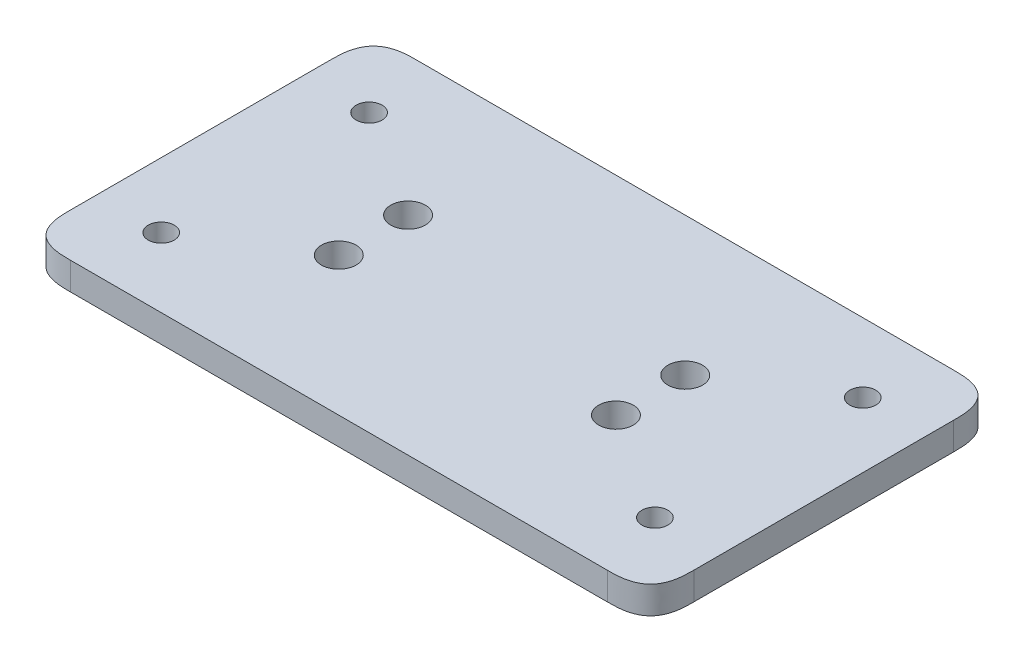
ISO-10303-21;
HEADER;
FILE_DESCRIPTION(('STEP AP214'),'2;1');
FILE_NAME('part.step','',(''),(''),'','','');
FILE_SCHEMA(('AUTOMOTIVE_DESIGN { 1 0 10303 214 1 1 1 1 }'));
ENDSEC;
DATA;
#1=APPLICATION_CONTEXT('core data for automotive mechanical design processes');
#2=APPLICATION_PROTOCOL_DEFINITION('international standard','automotive_design',2000,#1);
#3=PRODUCT_CONTEXT('',#1,'mechanical');
#4=PRODUCT('Part','Part','',(#3));
#5=PRODUCT_RELATED_PRODUCT_CATEGORY('part','',(#4));
#6=PRODUCT_DEFINITION_FORMATION('','',#4);
#7=PRODUCT_DEFINITION_CONTEXT('part definition',#1,'design');
#8=PRODUCT_DEFINITION('design','',#6,#7);
#9=PRODUCT_DEFINITION_SHAPE('','',#8);
#10=(LENGTH_UNIT() NAMED_UNIT(*) SI_UNIT(.MILLI.,.METRE.));
#11=(NAMED_UNIT(*) PLANE_ANGLE_UNIT() SI_UNIT($,.RADIAN.));
#12=(NAMED_UNIT(*) SI_UNIT($,.STERADIAN.) SOLID_ANGLE_UNIT());
#13=UNCERTAINTY_MEASURE_WITH_UNIT(LENGTH_MEASURE(1.E-05),#10,'distance_accuracy_value','');
#14=(GEOMETRIC_REPRESENTATION_CONTEXT(3) GLOBAL_UNCERTAINTY_ASSIGNED_CONTEXT((#13)) GLOBAL_UNIT_ASSIGNED_CONTEXT((#10,
#11,#12)) REPRESENTATION_CONTEXT('',''));
#15=CARTESIAN_POINT('',(0.,0.,0.));
#16=DIRECTION('',(0.,0.,1.));
#17=DIRECTION('',(1.,0.,0.));
#18=AXIS2_PLACEMENT_3D('',#15,#16,#17);
#19=CARTESIAN_POINT('',(72.,3.175,0.));
#20=DIRECTION('',(-1.,0.,0.));
#21=DIRECTION('',(0.,0.,1.));
#22=AXIS2_PLACEMENT_3D('',#19,#20,#21);
#23=PLANE('',#22);
#24=DIRECTION('',(0.,0.,-1.));
#25=VECTOR('',#24,1.);
#26=CARTESIAN_POINT('',(72.,3.175,0.));
#27=LINE('',#26,#25);
#28=CARTESIAN_POINT('',(72.,3.175,-5.));
#29=VERTEX_POINT('',#28);
#30=CARTESIAN_POINT('',(72.,3.175,-35.));
#31=VERTEX_POINT('',#30);
#32=EDGE_CURVE('E366',#29,#31,#27,.T.);
#33=ORIENTED_EDGE('',*,*,#32,.F.);
#34=CARTESIAN_POINT('',(72.,-0.15875,-5.));
#35=CARTESIAN_POINT('',(72.,1.00541666666667,-5.));
#36=CARTESIAN_POINT('',(72.,2.16958333333292,-5.));
#37=CARTESIAN_POINT('',(72.,3.33375,-5.));
#38=B_SPLINE_CURVE_WITH_KNOTS('',3,(#34,#35,#36,#37),.UNSPECIFIED.,.F.,.F.,(4,4),(-0.00015875,
0.00333375),.UNSPECIFIED.);
#39=CARTESIAN_POINT('',(72.,0.,-5.));
#40=VERTEX_POINT('',#39);
#41=EDGE_CURVE('E11',#29,#40,#38,.F.);
#42=ORIENTED_EDGE('',*,*,#41,.T.);
#43=DIRECTION('',(0.,0.,-1.));
#44=VECTOR('',#43,1.);
#45=CARTESIAN_POINT('',(72.,0.,0.));
#46=LINE('',#45,#44);
#47=CARTESIAN_POINT('',(72.,0.,-35.));
#48=VERTEX_POINT('',#47);
#49=EDGE_CURVE('E225',#40,#48,#46,.T.);
#50=ORIENTED_EDGE('',*,*,#49,.T.);
#51=CARTESIAN_POINT('',(72.,3.33375,-35.));
#52=CARTESIAN_POINT('',(72.,2.16958333333318,-35.));
#53=CARTESIAN_POINT('',(72.,1.00541666666667,-35.));
#54=CARTESIAN_POINT('',(72.,-0.15875,-35.));
#55=B_SPLINE_CURVE_WITH_KNOTS('',3,(#51,#52,#53,#54),.UNSPECIFIED.,.F.,.F.,(4,4),(-0.00333375,
0.00015875),.UNSPECIFIED.);
#56=EDGE_CURVE('E50',#48,#31,#55,.F.);
#57=ORIENTED_EDGE('',*,*,#56,.T.);
#58=EDGE_LOOP('',(#33,#42,#50,#57));
#59=FACE_BOUND('',#58,.T.);
#60=ADVANCED_FACE('F36',(#59),#23,.F.);
#61=CARTESIAN_POINT('',(0.,3.175,-40.));
#62=DIRECTION('',(0.,0.,-1.));
#63=DIRECTION('',(-1.,0.,0.));
#64=AXIS2_PLACEMENT_3D('',#61,#62,#63);
#65=PLANE('',#64);
#66=DIRECTION('',(1.,0.,0.));
#67=VECTOR('',#66,1.);
#68=CARTESIAN_POINT('',(0.,0.,-40.));
#69=LINE('',#68,#67);
#70=CARTESIAN_POINT('',(4.99999999999999,0.,-40.));
#71=VERTEX_POINT('',#70);
#72=CARTESIAN_POINT('',(67.,0.,-40.));
#73=VERTEX_POINT('',#72);
#74=EDGE_CURVE('E136',#71,#73,#69,.T.);
#75=ORIENTED_EDGE('',*,*,#74,.F.);
#76=CARTESIAN_POINT('',(4.99999999999999,3.33375,-40.));
#77=CARTESIAN_POINT('',(4.99999999999999,2.16958333333292,-40.));
#78=CARTESIAN_POINT('',(4.99999999999999,1.00541666666667,-40.));
#79=CARTESIAN_POINT('',(4.99999999999999,-0.15875,-40.));
#80=B_SPLINE_CURVE_WITH_KNOTS('',3,(#76,#77,#78,#79),.UNSPECIFIED.,.F.,.F.,(4,4),(-0.00015875,
0.00333375),.UNSPECIFIED.);
#81=CARTESIAN_POINT('',(4.99999999999999,3.175,-40.));
#82=VERTEX_POINT('',#81);
#83=EDGE_CURVE('E207',#71,#82,#80,.F.);
#84=ORIENTED_EDGE('',*,*,#83,.T.);
#85=DIRECTION('',(1.,0.,0.));
#86=VECTOR('',#85,1.);
#87=CARTESIAN_POINT('',(0.,3.175,-40.));
#88=LINE('',#87,#86);
#89=CARTESIAN_POINT('',(67.,3.175,-40.));
#90=VERTEX_POINT('',#89);
#91=EDGE_CURVE('E432',#82,#90,#88,.T.);
#92=ORIENTED_EDGE('',*,*,#91,.T.);
#93=CARTESIAN_POINT('',(67.,-0.15875,-40.));
#94=CARTESIAN_POINT('',(67.,1.00541666666667,-40.));
#95=CARTESIAN_POINT('',(67.,2.16958333333318,-40.));
#96=CARTESIAN_POINT('',(67.,3.33375,-40.));
#97=B_SPLINE_CURVE_WITH_KNOTS('',3,(#93,#94,#95,#96),.UNSPECIFIED.,.F.,.F.,(4,4),(-0.00333375,
0.00015875),.UNSPECIFIED.);
#98=EDGE_CURVE('E211',#90,#73,#97,.F.);
#99=ORIENTED_EDGE('',*,*,#98,.T.);
#100=EDGE_LOOP('',(#75,#84,#92,#99));
#101=FACE_BOUND('',#100,.T.);
#102=ADVANCED_FACE('F224',(#101),#65,.T.);
#103=CARTESIAN_POINT('',(0.,3.175,0.));
#104=DIRECTION('',(-1.,0.,0.));
#105=DIRECTION('',(0.,0.,1.));
#106=AXIS2_PLACEMENT_3D('',#103,#104,#105);
#107=PLANE('',#106);
#108=DIRECTION('',(0.,0.,-1.));
#109=VECTOR('',#108,1.);
#110=CARTESIAN_POINT('',(0.,3.175,0.));
#111=LINE('',#110,#109);
#112=CARTESIAN_POINT('',(0.,3.175,-5.));
#113=VERTEX_POINT('',#112);
#114=CARTESIAN_POINT('',(0.,3.175,-35.));
#115=VERTEX_POINT('',#114);
#116=EDGE_CURVE('E365',#113,#115,#111,.T.);
#117=ORIENTED_EDGE('',*,*,#116,.T.);
#118=CARTESIAN_POINT('',(0.,-0.15875,-35.));
#119=CARTESIAN_POINT('',(0.,1.00541666666667,-35.));
#120=CARTESIAN_POINT('',(0.,2.16958333333292,-35.));
#121=CARTESIAN_POINT('',(0.,3.33375,-35.));
#122=B_SPLINE_CURVE_WITH_KNOTS('',3,(#118,#119,#120,#121),.UNSPECIFIED.,.F.,.F.,(4,4),
(-0.00015875,0.00333375),.UNSPECIFIED.);
#123=CARTESIAN_POINT('',(0.,0.,-35.));
#124=VERTEX_POINT('',#123);
#125=EDGE_CURVE('E134',#115,#124,#122,.F.);
#126=ORIENTED_EDGE('',*,*,#125,.T.);
#127=DIRECTION('',(0.,0.,-1.));
#128=VECTOR('',#127,1.);
#129=CARTESIAN_POINT('',(0.,0.,0.));
#130=LINE('',#129,#128);
#131=CARTESIAN_POINT('',(0.,0.,-5.));
#132=VERTEX_POINT('',#131);
#133=EDGE_CURVE('E116',#132,#124,#130,.T.);
#134=ORIENTED_EDGE('',*,*,#133,.F.);
#135=CARTESIAN_POINT('',(0.,3.33375,-5.));
#136=CARTESIAN_POINT('',(0.,2.16958333333318,-5.));
#137=CARTESIAN_POINT('',(0.,1.00541666666667,-5.));
#138=CARTESIAN_POINT('',(0.,-0.15875,-5.));
#139=B_SPLINE_CURVE_WITH_KNOTS('',3,(#135,#136,#137,#138),.UNSPECIFIED.,.F.,.F.,(4,4),
(-0.00333375,0.00015875),.UNSPECIFIED.);
#140=EDGE_CURVE('E131',#132,#113,#139,.F.);
#141=ORIENTED_EDGE('',*,*,#140,.T.);
#142=EDGE_LOOP('',(#117,#126,#134,#141));
#143=FACE_BOUND('',#142,.T.);
#144=ADVANCED_FACE('F130',(#143),#107,.T.);
#145=CARTESIAN_POINT('',(7.5,3.175,-7.99999999999999));
#146=DIRECTION('',(0.,-1.,0.));
#147=DIRECTION('',(0.,0.,-1.));
#148=AXIS2_PLACEMENT_3D('',#145,#146,#147);
#149=CYLINDRICAL_SURFACE('',#148,1.5);
#150=CARTESIAN_POINT('',(7.5,3.175,-7.99999999999999));
#151=DIRECTION('',(0.,1.,0.));
#152=DIRECTION('',(0.,0.,1.));
#153=AXIS2_PLACEMENT_3D('',#150,#151,#152);
#154=CIRCLE('',#153,1.5);
#155=CARTESIAN_POINT('',(7.5,3.175,-6.5));
#156=VERTEX_POINT('',#155);
#157=EDGE_CURVE('E388',#156,#156,#154,.T.);
#158=ORIENTED_EDGE('',*,*,#157,.T.);
#159=EDGE_LOOP('',(#158));
#160=FACE_BOUND('',#159,.T.);
#161=CARTESIAN_POINT('',(7.5,0.,-7.99999999999999));
#162=DIRECTION('',(0.,1.,0.));
#163=DIRECTION('',(0.,0.,1.));
#164=AXIS2_PLACEMENT_3D('',#161,#162,#163);
#165=CIRCLE('',#164,1.5);
#166=CARTESIAN_POINT('',(7.5,0.,-6.5));
#167=VERTEX_POINT('',#166);
#168=EDGE_CURVE('E425',#167,#167,#165,.T.);
#169=ORIENTED_EDGE('',*,*,#168,.F.);
#170=EDGE_LOOP('',(#169));
#171=FACE_BOUND('',#170,.T.);
#172=ADVANCED_FACE('F635',(#160,#171),#149,.F.);
#173=CARTESIAN_POINT('',(20.,3.175,-24.));
#174=DIRECTION('',(0.,-1.,0.));
#175=DIRECTION('',(0.,0.,-1.));
#176=AXIS2_PLACEMENT_3D('',#173,#174,#175);
#177=CYLINDRICAL_SURFACE('',#176,2.);
#178=CARTESIAN_POINT('',(20.,3.175,-24.));
#179=DIRECTION('',(0.,1.,0.));
#180=DIRECTION('',(0.,0.,1.));
#181=AXIS2_PLACEMENT_3D('',#178,#179,#180);
#182=CIRCLE('',#181,2.);
#183=CARTESIAN_POINT('',(20.,3.175,-22.));
#184=VERTEX_POINT('',#183);
#185=EDGE_CURVE('E385',#184,#184,#182,.T.);
#186=ORIENTED_EDGE('',*,*,#185,.T.);
#187=EDGE_LOOP('',(#186));
#188=FACE_BOUND('',#187,.T.);
#189=CARTESIAN_POINT('',(20.,0.,-24.));
#190=DIRECTION('',(0.,1.,0.));
#191=DIRECTION('',(0.,0.,1.));
#192=AXIS2_PLACEMENT_3D('',#189,#190,#191);
#193=CIRCLE('',#192,2.);
#194=CARTESIAN_POINT('',(20.,0.,-22.));
#195=VERTEX_POINT('',#194);
#196=EDGE_CURVE('E422',#195,#195,#193,.T.);
#197=ORIENTED_EDGE('',*,*,#196,.F.);
#198=EDGE_LOOP('',(#197));
#199=FACE_BOUND('',#198,.T.);
#200=ADVANCED_FACE('F655',(#188,#199),#177,.F.);
#201=CARTESIAN_POINT('',(20.,3.175,-16.));
#202=DIRECTION('',(0.,-1.,0.));
#203=DIRECTION('',(0.,0.,-1.));
#204=AXIS2_PLACEMENT_3D('',#201,#202,#203);
#205=CYLINDRICAL_SURFACE('',#204,2.);
#206=CARTESIAN_POINT('',(20.,3.175,-16.));
#207=DIRECTION('',(0.,1.,0.));
#208=DIRECTION('',(0.,0.,1.));
#209=AXIS2_PLACEMENT_3D('',#206,#207,#208);
#210=CIRCLE('',#209,2.);
#211=CARTESIAN_POINT('',(20.,3.175,-14.));
#212=VERTEX_POINT('',#211);
#213=EDGE_CURVE('E382',#212,#212,#210,.T.);
#214=ORIENTED_EDGE('',*,*,#213,.T.);
#215=EDGE_LOOP('',(#214));
#216=FACE_BOUND('',#215,.T.);
#217=CARTESIAN_POINT('',(20.,0.,-16.));
#218=DIRECTION('',(0.,1.,0.));
#219=DIRECTION('',(0.,0.,1.));
#220=AXIS2_PLACEMENT_3D('',#217,#218,#219);
#221=CIRCLE('',#220,2.);
#222=CARTESIAN_POINT('',(20.,0.,-14.));
#223=VERTEX_POINT('',#222);
#224=EDGE_CURVE('E419',#223,#223,#221,.T.);
#225=ORIENTED_EDGE('',*,*,#224,.F.);
#226=EDGE_LOOP('',(#225));
#227=FACE_BOUND('',#226,.T.);
#228=ADVANCED_FACE('F662',(#216,#227),#205,.F.);
#229=CARTESIAN_POINT('',(64.5,3.175,-32.));
#230=DIRECTION('',(0.,-1.,0.));
#231=DIRECTION('',(0.,0.,-1.));
#232=AXIS2_PLACEMENT_3D('',#229,#230,#231);
#233=CYLINDRICAL_SURFACE('',#232,1.50000000000001);
#234=CARTESIAN_POINT('',(64.5,3.175,-32.));
#235=DIRECTION('',(0.,1.,0.));
#236=DIRECTION('',(0.,0.,1.));
#237=AXIS2_PLACEMENT_3D('',#234,#235,#236);
#238=CIRCLE('',#237,1.50000000000001);
#239=CARTESIAN_POINT('',(64.5,3.175,-30.5));
#240=VERTEX_POINT('',#239);
#241=EDGE_CURVE('E379',#240,#240,#238,.F.);
#242=ORIENTED_EDGE('',*,*,#241,.F.);
#243=EDGE_LOOP('',(#242));
#244=FACE_BOUND('',#243,.T.);
#245=CARTESIAN_POINT('',(64.5,0.,-32.));
#246=DIRECTION('',(0.,1.,0.));
#247=DIRECTION('',(0.,0.,1.));
#248=AXIS2_PLACEMENT_3D('',#245,#246,#247);
#249=CIRCLE('',#248,1.50000000000001);
#250=CARTESIAN_POINT('',(64.5,0.,-30.5));
#251=VERTEX_POINT('',#250);
#252=EDGE_CURVE('E416',#251,#251,#249,.F.);
#253=ORIENTED_EDGE('',*,*,#252,.T.);
#254=EDGE_LOOP('',(#253));
#255=FACE_BOUND('',#254,.T.);
#256=ADVANCED_FACE('F670',(#244,#255),#233,.F.);
#257=CARTESIAN_POINT('',(64.5,3.175,-8.));
#258=DIRECTION('',(0.,-1.,0.));
#259=DIRECTION('',(0.,0.,-1.));
#260=AXIS2_PLACEMENT_3D('',#257,#258,#259);
#261=CYLINDRICAL_SURFACE('',#260,1.5);
#262=CARTESIAN_POINT('',(64.5,3.175,-8.));
#263=DIRECTION('',(0.,1.,0.));
#264=DIRECTION('',(0.,0.,1.));
#265=AXIS2_PLACEMENT_3D('',#262,#263,#264);
#266=CIRCLE('',#265,1.5);
#267=CARTESIAN_POINT('',(64.5,3.175,-6.5));
#268=VERTEX_POINT('',#267);
#269=EDGE_CURVE('E376',#268,#268,#266,.F.);
#270=ORIENTED_EDGE('',*,*,#269,.F.);
#271=EDGE_LOOP('',(#270));
#272=FACE_BOUND('',#271,.T.);
#273=CARTESIAN_POINT('',(64.5,0.,-8.));
#274=DIRECTION('',(0.,1.,0.));
#275=DIRECTION('',(0.,0.,1.));
#276=AXIS2_PLACEMENT_3D('',#273,#274,#275);
#277=CIRCLE('',#276,1.5);
#278=CARTESIAN_POINT('',(64.5,0.,-6.5));
#279=VERTEX_POINT('',#278);
#280=EDGE_CURVE('E413',#279,#279,#277,.F.);
#281=ORIENTED_EDGE('',*,*,#280,.T.);
#282=EDGE_LOOP('',(#281));
#283=FACE_BOUND('',#282,.T.);
#284=ADVANCED_FACE('F678',(#272,#283),#261,.F.);
#285=CARTESIAN_POINT('',(52.,3.175,-16.));
#286=DIRECTION('',(0.,-1.,0.));
#287=DIRECTION('',(0.,0.,-1.));
#288=AXIS2_PLACEMENT_3D('',#285,#286,#287);
#289=CYLINDRICAL_SURFACE('',#288,2.);
#290=CARTESIAN_POINT('',(52.,3.175,-16.));
#291=DIRECTION('',(0.,1.,0.));
#292=DIRECTION('',(0.,0.,1.));
#293=AXIS2_PLACEMENT_3D('',#290,#291,#292);
#294=CIRCLE('',#293,2.);
#295=CARTESIAN_POINT('',(52.,3.175,-14.));
#296=VERTEX_POINT('',#295);
#297=EDGE_CURVE('E364',#296,#296,#294,.T.);
#298=ORIENTED_EDGE('',*,*,#297,.T.);
#299=EDGE_LOOP('',(#298));
#300=FACE_BOUND('',#299,.T.);
#301=CARTESIAN_POINT('',(52.,0.,-16.));
#302=DIRECTION('',(0.,1.,0.));
#303=DIRECTION('',(0.,0.,1.));
#304=AXIS2_PLACEMENT_3D('',#301,#302,#303);
#305=CIRCLE('',#304,2.);
#306=CARTESIAN_POINT('',(52.,0.,-14.));
#307=VERTEX_POINT('',#306);
#308=EDGE_CURVE('E406',#307,#307,#305,.T.);
#309=ORIENTED_EDGE('',*,*,#308,.F.);
#310=EDGE_LOOP('',(#309));
#311=FACE_BOUND('',#310,.T.);
#312=ADVANCED_FACE('F305',(#300,#311),#289,.F.);
#313=CARTESIAN_POINT('',(0.,3.175,0.));
#314=DIRECTION('',(0.,0.,-1.));
#315=DIRECTION('',(-1.,0.,0.));
#316=AXIS2_PLACEMENT_3D('',#313,#314,#315);
#317=PLANE('',#316);
#318=DIRECTION('',(1.,0.,0.));
#319=VECTOR('',#318,1.);
#320=CARTESIAN_POINT('',(0.,3.175,0.));
#321=LINE('',#320,#319);
#322=CARTESIAN_POINT('',(5.,3.175,0.));
#323=VERTEX_POINT('',#322);
#324=CARTESIAN_POINT('',(67.,3.175,0.));
#325=VERTEX_POINT('',#324);
#326=EDGE_CURVE('E361',#323,#325,#321,.T.);
#327=ORIENTED_EDGE('',*,*,#326,.F.);
#328=CARTESIAN_POINT('',(5.,-0.15875,0.));
#329=CARTESIAN_POINT('',(5.,1.00541666666667,0.));
#330=CARTESIAN_POINT('',(5.,2.16958333333318,0.));
#331=CARTESIAN_POINT('',(5.,3.33375,0.));
#332=B_SPLINE_CURVE_WITH_KNOTS('',3,(#328,#329,#330,#331),.UNSPECIFIED.,.F.,.F.,(4,4),
(-0.00333375,0.00015875),.UNSPECIFIED.);
#333=CARTESIAN_POINT('',(5.,0.,0.));
#334=VERTEX_POINT('',#333);
#335=EDGE_CURVE('E195',#323,#334,#332,.F.);
#336=ORIENTED_EDGE('',*,*,#335,.T.);
#337=DIRECTION('',(1.,0.,0.));
#338=VECTOR('',#337,1.);
#339=CARTESIAN_POINT('',(0.,0.,0.));
#340=LINE('',#339,#338);
#341=CARTESIAN_POINT('',(67.,0.,0.));
#342=VERTEX_POINT('',#341);
#343=EDGE_CURVE('E117',#334,#342,#340,.T.);
#344=ORIENTED_EDGE('',*,*,#343,.T.);
#345=CARTESIAN_POINT('',(67.,3.33375,0.));
#346=CARTESIAN_POINT('',(67.,2.16958333333292,0.));
#347=CARTESIAN_POINT('',(67.,1.00541666666667,0.));
#348=CARTESIAN_POINT('',(67.,-0.15875,0.));
#349=B_SPLINE_CURVE_WITH_KNOTS('',3,(#345,#346,#347,#348),.UNSPECIFIED.,.F.,.F.,(4,4),
(-0.00015875,0.00333375),.UNSPECIFIED.);
#350=EDGE_CURVE('E57',#342,#325,#349,.F.);
#351=ORIENTED_EDGE('',*,*,#350,.T.);
#352=EDGE_LOOP('',(#327,#336,#344,#351));
#353=FACE_BOUND('',#352,.T.);
#354=ADVANCED_FACE('F296',(#353),#317,.F.);
#355=CARTESIAN_POINT('',(52.,3.175,-24.));
#356=DIRECTION('',(0.,-1.,0.));
#357=DIRECTION('',(0.,0.,-1.));
#358=AXIS2_PLACEMENT_3D('',#355,#356,#357);
#359=CYLINDRICAL_SURFACE('',#358,2.);
#360=CARTESIAN_POINT('',(52.,3.175,-24.));
#361=DIRECTION('',(0.,1.,0.));
#362=DIRECTION('',(0.,0.,1.));
#363=AXIS2_PLACEMENT_3D('',#360,#361,#362);
#364=CIRCLE('',#363,2.);
#365=CARTESIAN_POINT('',(52.,3.175,-22.));
#366=VERTEX_POINT('',#365);
#367=EDGE_CURVE('E430',#366,#366,#364,.T.);
#368=ORIENTED_EDGE('',*,*,#367,.T.);
#369=EDGE_LOOP('',(#368));
#370=FACE_BOUND('',#369,.T.);
#371=CARTESIAN_POINT('',(52.,0.,-24.));
#372=DIRECTION('',(0.,1.,0.));
#373=DIRECTION('',(0.,0.,1.));
#374=AXIS2_PLACEMENT_3D('',#371,#372,#373);
#375=CIRCLE('',#374,2.);
#376=CARTESIAN_POINT('',(52.,0.,-22.));
#377=VERTEX_POINT('',#376);
#378=EDGE_CURVE('E393',#377,#377,#375,.T.);
#379=ORIENTED_EDGE('',*,*,#378,.F.);
#380=EDGE_LOOP('',(#379));
#381=FACE_BOUND('',#380,.T.);
#382=ADVANCED_FACE('F279',(#370,#381),#359,.F.);
#383=CARTESIAN_POINT('',(7.49999999999998,3.175,-32.));
#384=DIRECTION('',(0.,-1.,0.));
#385=DIRECTION('',(0.,0.,-1.));
#386=AXIS2_PLACEMENT_3D('',#383,#384,#385);
#387=CYLINDRICAL_SURFACE('',#386,1.5);
#388=CARTESIAN_POINT('',(7.49999999999998,3.175,-32.));
#389=DIRECTION('',(0.,1.,0.));
#390=DIRECTION('',(0.,0.,1.));
#391=AXIS2_PLACEMENT_3D('',#388,#389,#390);
#392=CIRCLE('',#391,1.5);
#393=CARTESIAN_POINT('',(7.49999999999998,3.175,-30.5));
#394=VERTEX_POINT('',#393);
#395=EDGE_CURVE('E141',#394,#394,#392,.T.);
#396=ORIENTED_EDGE('',*,*,#395,.T.);
#397=EDGE_LOOP('',(#396));
#398=FACE_BOUND('',#397,.T.);
#399=CARTESIAN_POINT('',(7.49999999999998,0.,-32.));
#400=DIRECTION('',(0.,1.,0.));
#401=DIRECTION('',(0.,0.,1.));
#402=AXIS2_PLACEMENT_3D('',#399,#400,#401);
#403=CIRCLE('',#402,1.5);
#404=CARTESIAN_POINT('',(7.49999999999998,0.,-30.5));
#405=VERTEX_POINT('',#404);
#406=EDGE_CURVE('E428',#405,#405,#403,.T.);
#407=ORIENTED_EDGE('',*,*,#406,.F.);
#408=EDGE_LOOP('',(#407));
#409=FACE_BOUND('',#408,.T.);
#410=ADVANCED_FACE('F330',(#398,#409),#387,.F.);
#411=CARTESIAN_POINT('',(0.,3.175,0.));
#412=DIRECTION('',(0.,1.,0.));
#413=DIRECTION('',(0.,0.,1.));
#414=AXIS2_PLACEMENT_3D('',#411,#412,#413);
#415=PLANE('',#414);
#416=ORIENTED_EDGE('',*,*,#367,.F.);
#417=EDGE_LOOP('',(#416));
#418=FACE_BOUND('',#417,.T.);
#419=ORIENTED_EDGE('',*,*,#91,.F.);
#420=CARTESIAN_POINT('',(0.,3.175,-35.));
#421=CARTESIAN_POINT('',(0.,3.175,-35.8409902576697));
#422=CARTESIAN_POINT('',(0.,3.175,-36.6819805153395));
#423=CARTESIAN_POINT('',(0.358459599180405,3.175,-38.5355339059327));
#424=CARTESIAN_POINT('',(1.46446609406725,3.175,-39.6415404008196));
#425=CARTESIAN_POINT('',(3.31801948466052,3.175,-40.));
#426=CARTESIAN_POINT('',(4.15900974233026,3.175,-40.));
#427=CARTESIAN_POINT('',(4.99999999999999,3.175,-40.));
#428=B_SPLINE_CURVE_WITH_KNOTS('',5,(#420,#421,#422,#423,#424,#425,#426,#427),.UNSPECIFIED.,.F.,
.F.,(6,2,6),(0.,0.5,1.),.UNSPECIFIED.);
#429=EDGE_CURVE('E197',#82,#115,#428,.F.);
#430=ORIENTED_EDGE('',*,*,#429,.T.);
#431=ORIENTED_EDGE('',*,*,#116,.F.);
#432=CARTESIAN_POINT('',(5.,3.175,0.));
#433=CARTESIAN_POINT('',(4.15900974233027,3.175,0.));
#434=CARTESIAN_POINT('',(3.31801948466053,3.175,0.));
#435=CARTESIAN_POINT('',(1.46446609406726,3.175,-0.358459599180416));
#436=CARTESIAN_POINT('',(0.358459599180416,3.175,-1.46446609406726));
#437=CARTESIAN_POINT('',(0.,3.175,-3.31801948466053));
#438=CARTESIAN_POINT('',(0.,3.175,-4.15900974233027));
#439=CARTESIAN_POINT('',(0.,3.175,-5.));
#440=B_SPLINE_CURVE_WITH_KNOTS('',5,(#432,#433,#434,#435,#436,#437,#438,#439),.UNSPECIFIED.,.F.,
.F.,(6,2,6),(0.,0.5,1.),.UNSPECIFIED.);
#441=EDGE_CURVE('E65',#113,#323,#440,.F.);
#442=ORIENTED_EDGE('',*,*,#441,.T.);
#443=ORIENTED_EDGE('',*,*,#326,.T.);
#444=CARTESIAN_POINT('',(72.,3.175,-5.));
#445=CARTESIAN_POINT('',(72.,3.175,-4.15900974233027));
#446=CARTESIAN_POINT('',(72.,3.175,-3.31801948466054));
#447=CARTESIAN_POINT('',(71.6415404008196,3.175,-1.46446609406726));
#448=CARTESIAN_POINT('',(70.5355339059327,3.175,-0.358459599180416));
#449=CARTESIAN_POINT('',(68.6819805153395,3.175,0.));
#450=CARTESIAN_POINT('',(67.8409902576697,3.175,0.));
#451=CARTESIAN_POINT('',(67.,3.175,0.));
#452=B_SPLINE_CURVE_WITH_KNOTS('',5,(#444,#445,#446,#447,#448,#449,#450,#451),.UNSPECIFIED.,.F.,
.F.,(6,2,6),(0.,0.5,1.),.UNSPECIFIED.);
#453=EDGE_CURVE('E201',#325,#29,#452,.F.);
#454=ORIENTED_EDGE('',*,*,#453,.T.);
#455=ORIENTED_EDGE('',*,*,#32,.T.);
#456=CARTESIAN_POINT('',(67.,3.175,-40.));
#457=CARTESIAN_POINT('',(67.8409902576697,3.175,-40.));
#458=CARTESIAN_POINT('',(68.6819805153395,3.175,-40.));
#459=CARTESIAN_POINT('',(70.5355339059327,3.175,-39.6415404008196));
#460=CARTESIAN_POINT('',(71.6415404008196,3.175,-38.5355339059328));
#461=CARTESIAN_POINT('',(72.,3.175,-36.6819805153395));
#462=CARTESIAN_POINT('',(72.,3.175,-35.8409902576697));
#463=CARTESIAN_POINT('',(72.,3.175,-35.));
#464=B_SPLINE_CURVE_WITH_KNOTS('',5,(#456,#457,#458,#459,#460,#461,#462,#463),.UNSPECIFIED.,.F.,
.F.,(6,2,6),(0.,0.5,1.),.UNSPECIFIED.);
#465=EDGE_CURVE('E202',#31,#90,#464,.F.);
#466=ORIENTED_EDGE('',*,*,#465,.T.);
#467=EDGE_LOOP('',(#419,#430,#431,#442,#443,#454,#455,#466));
#468=FACE_BOUND('',#467,.T.);
#469=ORIENTED_EDGE('',*,*,#297,.F.);
#470=EDGE_LOOP('',(#469));
#471=FACE_BOUND('',#470,.T.);
#472=ORIENTED_EDGE('',*,*,#269,.T.);
#473=EDGE_LOOP('',(#472));
#474=FACE_BOUND('',#473,.T.);
#475=ORIENTED_EDGE('',*,*,#241,.T.);
#476=EDGE_LOOP('',(#475));
#477=FACE_BOUND('',#476,.T.);
#478=ORIENTED_EDGE('',*,*,#213,.F.);
#479=EDGE_LOOP('',(#478));
#480=FACE_BOUND('',#479,.T.);
#481=ORIENTED_EDGE('',*,*,#185,.F.);
#482=EDGE_LOOP('',(#481));
#483=FACE_BOUND('',#482,.T.);
#484=ORIENTED_EDGE('',*,*,#157,.F.);
#485=EDGE_LOOP('',(#484));
#486=FACE_BOUND('',#485,.T.);
#487=ORIENTED_EDGE('',*,*,#395,.F.);
#488=EDGE_LOOP('',(#487));
#489=FACE_BOUND('',#488,.T.);
#490=ADVANCED_FACE('F321',(#418,#468,#471,#474,#477,#480,#483,#486,#489),#415,.T.);
#491=CARTESIAN_POINT('',(0.,0.,0.));
#492=DIRECTION('',(0.,1.,0.));
#493=DIRECTION('',(0.,0.,1.));
#494=AXIS2_PLACEMENT_3D('',#491,#492,#493);
#495=PLANE('',#494);
#496=ORIENTED_EDGE('',*,*,#378,.T.);
#497=EDGE_LOOP('',(#496));
#498=FACE_BOUND('',#497,.T.);
#499=ORIENTED_EDGE('',*,*,#133,.T.);
#500=CARTESIAN_POINT('',(4.99999999999999,0.,-40.));
#501=CARTESIAN_POINT('',(4.15900974233026,0.,-40.));
#502=CARTESIAN_POINT('',(3.31801948466052,0.,-40.));
#503=CARTESIAN_POINT('',(1.46446609406725,0.,-39.6415404008196));
#504=CARTESIAN_POINT('',(0.358459599180405,0.,-38.5355339059327));
#505=CARTESIAN_POINT('',(0.,0.,-36.6819805153395));
#506=CARTESIAN_POINT('',(0.,0.,-35.8409902576697));
#507=CARTESIAN_POINT('',(0.,0.,-35.));
#508=B_SPLINE_CURVE_WITH_KNOTS('',5,(#500,#501,#502,#503,#504,#505,#506,#507),.UNSPECIFIED.,.F.,
.F.,(6,2,6),(0.,0.5,1.),.UNSPECIFIED.);
#509=EDGE_CURVE('E123',#124,#71,#508,.F.);
#510=ORIENTED_EDGE('',*,*,#509,.T.);
#511=ORIENTED_EDGE('',*,*,#74,.T.);
#512=CARTESIAN_POINT('',(72.,0.,-35.));
#513=CARTESIAN_POINT('',(72.,0.,-35.8409902576697));
#514=CARTESIAN_POINT('',(72.,0.,-36.6819805153395));
#515=CARTESIAN_POINT('',(71.6415404008196,0.,-38.5355339059328));
#516=CARTESIAN_POINT('',(70.5355339059327,0.,-39.6415404008196));
#517=CARTESIAN_POINT('',(68.6819805153395,0.,-40.));
#518=CARTESIAN_POINT('',(67.8409902576697,0.,-40.));
#519=CARTESIAN_POINT('',(67.,0.,-40.));
#520=B_SPLINE_CURVE_WITH_KNOTS('',5,(#512,#513,#514,#515,#516,#517,#518,#519),.UNSPECIFIED.,.F.,
.F.,(6,2,6),(0.,0.5,1.),.UNSPECIFIED.);
#521=EDGE_CURVE('E563',#73,#48,#520,.F.);
#522=ORIENTED_EDGE('',*,*,#521,.T.);
#523=ORIENTED_EDGE('',*,*,#49,.F.);
#524=CARTESIAN_POINT('',(67.,0.,0.));
#525=CARTESIAN_POINT('',(67.8409902576697,0.,0.));
#526=CARTESIAN_POINT('',(68.6819805153395,0.,0.));
#527=CARTESIAN_POINT('',(70.5355339059327,0.,-0.358459599180416));
#528=CARTESIAN_POINT('',(71.6415404008196,0.,-1.46446609406726));
#529=CARTESIAN_POINT('',(72.,0.,-3.31801948466054));
#530=CARTESIAN_POINT('',(72.,0.,-4.15900974233027));
#531=CARTESIAN_POINT('',(72.,0.,-5.));
#532=B_SPLINE_CURVE_WITH_KNOTS('',5,(#524,#525,#526,#527,#528,#529,#530,#531),.UNSPECIFIED.,.F.,
.F.,(6,2,6),(0.,0.5,1.),.UNSPECIFIED.);
#533=EDGE_CURVE('E124',#40,#342,#532,.F.);
#534=ORIENTED_EDGE('',*,*,#533,.T.);
#535=ORIENTED_EDGE('',*,*,#343,.F.);
#536=CARTESIAN_POINT('',(0.,0.,-5.));
#537=CARTESIAN_POINT('',(0.,0.,-4.15900974233027));
#538=CARTESIAN_POINT('',(0.,0.,-3.31801948466053));
#539=CARTESIAN_POINT('',(0.358459599180416,0.,-1.46446609406726));
#540=CARTESIAN_POINT('',(1.46446609406726,0.,-0.358459599180416));
#541=CARTESIAN_POINT('',(3.31801948466053,0.,0.));
#542=CARTESIAN_POINT('',(4.15900974233027,0.,0.));
#543=CARTESIAN_POINT('',(5.,0.,0.));
#544=B_SPLINE_CURVE_WITH_KNOTS('',5,(#536,#537,#538,#539,#540,#541,#542,#543),.UNSPECIFIED.,.F.,
.F.,(6,2,6),(0.,0.5,1.),.UNSPECIFIED.);
#545=EDGE_CURVE('E111',#334,#132,#544,.F.);
#546=ORIENTED_EDGE('',*,*,#545,.T.);
#547=EDGE_LOOP('',(#499,#510,#511,#522,#523,#534,#535,#546));
#548=FACE_BOUND('',#547,.T.);
#549=ORIENTED_EDGE('',*,*,#308,.T.);
#550=EDGE_LOOP('',(#549));
#551=FACE_BOUND('',#550,.T.);
#552=ORIENTED_EDGE('',*,*,#280,.F.);
#553=EDGE_LOOP('',(#552));
#554=FACE_BOUND('',#553,.T.);
#555=ORIENTED_EDGE('',*,*,#252,.F.);
#556=EDGE_LOOP('',(#555));
#557=FACE_BOUND('',#556,.T.);
#558=ORIENTED_EDGE('',*,*,#224,.T.);
#559=EDGE_LOOP('',(#558));
#560=FACE_BOUND('',#559,.T.);
#561=ORIENTED_EDGE('',*,*,#196,.T.);
#562=EDGE_LOOP('',(#561));
#563=FACE_BOUND('',#562,.T.);
#564=ORIENTED_EDGE('',*,*,#168,.T.);
#565=EDGE_LOOP('',(#564));
#566=FACE_BOUND('',#565,.T.);
#567=ORIENTED_EDGE('',*,*,#406,.T.);
#568=EDGE_LOOP('',(#567));
#569=FACE_BOUND('',#568,.T.);
#570=ADVANCED_FACE('F114',(#498,#548,#551,#554,#557,#560,#563,#566,#569),#495,.F.);
#571=CARTESIAN_POINT('',(0.,3.33375,-35.));
#572=CARTESIAN_POINT('',(0.,2.16958333333292,-35.));
#573=CARTESIAN_POINT('',(0.,1.00541666666667,-35.));
#574=CARTESIAN_POINT('',(0.,-0.15875,-35.));
#575=CARTESIAN_POINT('',(0.,3.33375,-35.8409902576697));
#576=CARTESIAN_POINT('',(0.,2.16958333333292,-35.8409902576697));
#577=CARTESIAN_POINT('',(0.,1.00541666666667,-35.8409902576697));
#578=CARTESIAN_POINT('',(0.,-0.15875,-35.8409902576697));
#579=CARTESIAN_POINT('',(0.,3.33375,-36.6819805153395));
#580=CARTESIAN_POINT('',(0.,2.16958333333292,-36.6819805153395));
#581=CARTESIAN_POINT('',(0.,1.00541666666667,-36.6819805153395));
#582=CARTESIAN_POINT('',(0.,-0.15875,-36.6819805153395));
#583=CARTESIAN_POINT('',(0.358459599180405,3.33375,-38.5355339059327));
#584=CARTESIAN_POINT('',(0.358459599180405,2.16958333333292,-38.5355339059327));
#585=CARTESIAN_POINT('',(0.358459599180405,1.00541666666667,-38.5355339059327));
#586=CARTESIAN_POINT('',(0.358459599180405,-0.15875,-38.5355339059327));
#587=CARTESIAN_POINT('',(1.46446609406725,3.33375,-39.6415404008196));
#588=CARTESIAN_POINT('',(1.46446609406725,2.16958333333292,-39.6415404008196));
#589=CARTESIAN_POINT('',(1.46446609406725,1.00541666666667,-39.6415404008196));
#590=CARTESIAN_POINT('',(1.46446609406725,-0.15875,-39.6415404008196));
#591=CARTESIAN_POINT('',(3.31801948466052,3.33375,-40.));
#592=CARTESIAN_POINT('',(3.31801948466052,2.16958333333292,-40.));
#593=CARTESIAN_POINT('',(3.31801948466052,1.00541666666667,-40.));
#594=CARTESIAN_POINT('',(3.31801948466052,-0.15875,-40.));
#595=CARTESIAN_POINT('',(4.15900974233026,3.33375,-40.));
#596=CARTESIAN_POINT('',(4.15900974233026,2.16958333333292,-40.));
#597=CARTESIAN_POINT('',(4.15900974233026,1.00541666666667,-40.));
#598=CARTESIAN_POINT('',(4.15900974233026,-0.15875,-40.));
#599=CARTESIAN_POINT('',(4.99999999999999,3.33375,-40.));
#600=CARTESIAN_POINT('',(4.99999999999999,2.16958333333292,-40.));
#601=CARTESIAN_POINT('',(4.99999999999999,1.00541666666667,-40.));
#602=CARTESIAN_POINT('',(4.99999999999999,-0.15875,-40.));
#603=B_SPLINE_SURFACE_WITH_KNOTS('',5,3,((#571,#572,#573,#574),(#575,#576,#577,#578),(#579,#580,
#581,#582),(#583,#584,#585,#586),(#587,#588,#589,#590),(#591,#592,#593,#594),(#595,#596,#597,
#598),(#599,#600,#601,#602)),.UNSPECIFIED.,.F.,.F.,.F.,(6,2,6),(4,4),(0.,0.5,1.),(-0.00015875,
0.00333375),.UNSPECIFIED.);
#604=ORIENTED_EDGE('',*,*,#429,.F.);
#605=ORIENTED_EDGE('',*,*,#83,.F.);
#606=ORIENTED_EDGE('',*,*,#509,.F.);
#607=ORIENTED_EDGE('',*,*,#125,.F.);
#608=EDGE_LOOP('',(#604,#605,#606,#607));
#609=FACE_BOUND('',#608,.T.);
#610=ADVANCED_FACE('F167',(#609),#603,.T.);
#611=CARTESIAN_POINT('',(0.,-0.15875,-5.));
#612=CARTESIAN_POINT('',(0.,1.00541666666667,-5.));
#613=CARTESIAN_POINT('',(0.,2.16958333333318,-5.));
#614=CARTESIAN_POINT('',(0.,3.33375,-5.));
#615=CARTESIAN_POINT('',(0.,-0.15875,-4.15900974233027));
#616=CARTESIAN_POINT('',(0.,1.00541666666667,-4.15900974233027));
#617=CARTESIAN_POINT('',(0.,2.16958333333318,-4.15900974233027));
#618=CARTESIAN_POINT('',(0.,3.33375,-4.15900974233027));
#619=CARTESIAN_POINT('',(0.,-0.15875,-3.31801948466053));
#620=CARTESIAN_POINT('',(0.,1.00541666666667,-3.31801948466053));
#621=CARTESIAN_POINT('',(0.,2.16958333333318,-3.31801948466053));
#622=CARTESIAN_POINT('',(0.,3.33375,-3.31801948466053));
#623=CARTESIAN_POINT('',(0.358459599180416,-0.15875,-1.46446609406726));
#624=CARTESIAN_POINT('',(0.358459599180416,1.00541666666667,-1.46446609406726));
#625=CARTESIAN_POINT('',(0.358459599180416,2.16958333333318,-1.46446609406726));
#626=CARTESIAN_POINT('',(0.358459599180416,3.33375,-1.46446609406726));
#627=CARTESIAN_POINT('',(1.46446609406726,-0.15875,-0.358459599180416));
#628=CARTESIAN_POINT('',(1.46446609406726,1.00541666666667,-0.358459599180416));
#629=CARTESIAN_POINT('',(1.46446609406726,2.16958333333318,-0.358459599180416));
#630=CARTESIAN_POINT('',(1.46446609406726,3.33375,-0.358459599180416));
#631=CARTESIAN_POINT('',(3.31801948466053,-0.15875,0.));
#632=CARTESIAN_POINT('',(3.31801948466053,1.00541666666667,0.));
#633=CARTESIAN_POINT('',(3.31801948466053,2.16958333333318,0.));
#634=CARTESIAN_POINT('',(3.31801948466053,3.33375,0.));
#635=CARTESIAN_POINT('',(4.15900974233027,-0.15875,0.));
#636=CARTESIAN_POINT('',(4.15900974233027,1.00541666666667,0.));
#637=CARTESIAN_POINT('',(4.15900974233027,2.16958333333318,0.));
#638=CARTESIAN_POINT('',(4.15900974233027,3.33375,0.));
#639=CARTESIAN_POINT('',(5.,-0.15875,0.));
#640=CARTESIAN_POINT('',(5.,1.00541666666667,0.));
#641=CARTESIAN_POINT('',(5.,2.16958333333318,0.));
#642=CARTESIAN_POINT('',(5.,3.33375,0.));
#643=B_SPLINE_SURFACE_WITH_KNOTS('',5,3,((#611,#612,#613,#614),(#615,#616,#617,#618),(#619,#620,
#621,#622),(#623,#624,#625,#626),(#627,#628,#629,#630),(#631,#632,#633,#634),(#635,#636,#637,
#638),(#639,#640,#641,#642)),.UNSPECIFIED.,.F.,.F.,.F.,(6,2,6),(4,4),(0.,0.5,1.),(-0.00333375,
0.00015875),.UNSPECIFIED.);
#644=ORIENTED_EDGE('',*,*,#441,.F.);
#645=ORIENTED_EDGE('',*,*,#140,.F.);
#646=ORIENTED_EDGE('',*,*,#545,.F.);
#647=ORIENTED_EDGE('',*,*,#335,.F.);
#648=EDGE_LOOP('',(#644,#645,#646,#647));
#649=FACE_BOUND('',#648,.T.);
#650=ADVANCED_FACE('F139',(#649),#643,.T.);
#651=CARTESIAN_POINT('',(72.,3.33375,-5.));
#652=CARTESIAN_POINT('',(72.,2.16958333333292,-5.));
#653=CARTESIAN_POINT('',(72.,1.00541666666667,-5.));
#654=CARTESIAN_POINT('',(72.,-0.15875,-5.));
#655=CARTESIAN_POINT('',(72.,3.33375,-4.15900974233027));
#656=CARTESIAN_POINT('',(72.,2.16958333333292,-4.15900974233027));
#657=CARTESIAN_POINT('',(72.,1.00541666666667,-4.15900974233027));
#658=CARTESIAN_POINT('',(72.,-0.15875,-4.15900974233027));
#659=CARTESIAN_POINT('',(72.,3.33375,-3.31801948466054));
#660=CARTESIAN_POINT('',(72.,2.16958333333292,-3.31801948466054));
#661=CARTESIAN_POINT('',(72.,1.00541666666667,-3.31801948466054));
#662=CARTESIAN_POINT('',(72.,-0.15875,-3.31801948466054));
#663=CARTESIAN_POINT('',(71.6415404008196,3.33375,-1.46446609406726));
#664=CARTESIAN_POINT('',(71.6415404008196,2.16958333333292,-1.46446609406726));
#665=CARTESIAN_POINT('',(71.6415404008196,1.00541666666667,-1.46446609406726));
#666=CARTESIAN_POINT('',(71.6415404008196,-0.15875,-1.46446609406726));
#667=CARTESIAN_POINT('',(70.5355339059327,3.33375,-0.358459599180416));
#668=CARTESIAN_POINT('',(70.5355339059327,2.16958333333292,-0.358459599180416));
#669=CARTESIAN_POINT('',(70.5355339059327,1.00541666666667,-0.358459599180416));
#670=CARTESIAN_POINT('',(70.5355339059327,-0.15875,-0.358459599180416));
#671=CARTESIAN_POINT('',(68.6819805153395,3.33375,0.));
#672=CARTESIAN_POINT('',(68.6819805153395,2.16958333333292,0.));
#673=CARTESIAN_POINT('',(68.6819805153395,1.00541666666667,0.));
#674=CARTESIAN_POINT('',(68.6819805153395,-0.15875,0.));
#675=CARTESIAN_POINT('',(67.8409902576697,3.33375,0.));
#676=CARTESIAN_POINT('',(67.8409902576697,2.16958333333292,0.));
#677=CARTESIAN_POINT('',(67.8409902576697,1.00541666666667,0.));
#678=CARTESIAN_POINT('',(67.8409902576697,-0.15875,0.));
#679=CARTESIAN_POINT('',(67.,3.33375,0.));
#680=CARTESIAN_POINT('',(67.,2.16958333333292,0.));
#681=CARTESIAN_POINT('',(67.,1.00541666666667,0.));
#682=CARTESIAN_POINT('',(67.,-0.15875,0.));
#683=B_SPLINE_SURFACE_WITH_KNOTS('',5,3,((#651,#652,#653,#654),(#655,#656,#657,#658),(#659,#660,
#661,#662),(#663,#664,#665,#666),(#667,#668,#669,#670),(#671,#672,#673,#674),(#675,#676,#677,
#678),(#679,#680,#681,#682)),.UNSPECIFIED.,.F.,.F.,.F.,(6,2,6),(4,4),(0.,0.5,1.),(-0.00015875,
0.00333375),.UNSPECIFIED.);
#684=ORIENTED_EDGE('',*,*,#453,.F.);
#685=ORIENTED_EDGE('',*,*,#350,.F.);
#686=ORIENTED_EDGE('',*,*,#533,.F.);
#687=ORIENTED_EDGE('',*,*,#41,.F.);
#688=EDGE_LOOP('',(#684,#685,#686,#687));
#689=FACE_BOUND('',#688,.T.);
#690=ADVANCED_FACE('F166',(#689),#683,.T.);
#691=CARTESIAN_POINT('',(72.,-0.15875,-35.));
#692=CARTESIAN_POINT('',(72.,1.00541666666667,-35.));
#693=CARTESIAN_POINT('',(72.,2.16958333333318,-35.));
#694=CARTESIAN_POINT('',(72.,3.33375,-35.));
#695=CARTESIAN_POINT('',(72.,-0.15875,-35.8409902576697));
#696=CARTESIAN_POINT('',(72.,1.00541666666667,-35.8409902576697));
#697=CARTESIAN_POINT('',(72.,2.16958333333318,-35.8409902576697));
#698=CARTESIAN_POINT('',(72.,3.33375,-35.8409902576697));
#699=CARTESIAN_POINT('',(72.,-0.15875,-36.6819805153395));
#700=CARTESIAN_POINT('',(72.,1.00541666666667,-36.6819805153395));
#701=CARTESIAN_POINT('',(72.,2.16958333333318,-36.6819805153395));
#702=CARTESIAN_POINT('',(72.,3.33375,-36.6819805153395));
#703=CARTESIAN_POINT('',(71.6415404008196,-0.15875,-38.5355339059328));
#704=CARTESIAN_POINT('',(71.6415404008196,1.00541666666667,-38.5355339059328));
#705=CARTESIAN_POINT('',(71.6415404008196,2.16958333333318,-38.5355339059328));
#706=CARTESIAN_POINT('',(71.6415404008196,3.33375,-38.5355339059328));
#707=CARTESIAN_POINT('',(70.5355339059327,-0.15875,-39.6415404008196));
#708=CARTESIAN_POINT('',(70.5355339059327,1.00541666666667,-39.6415404008196));
#709=CARTESIAN_POINT('',(70.5355339059327,2.16958333333318,-39.6415404008196));
#710=CARTESIAN_POINT('',(70.5355339059327,3.33375,-39.6415404008196));
#711=CARTESIAN_POINT('',(68.6819805153395,-0.15875,-40.));
#712=CARTESIAN_POINT('',(68.6819805153395,1.00541666666667,-40.));
#713=CARTESIAN_POINT('',(68.6819805153395,2.16958333333318,-40.));
#714=CARTESIAN_POINT('',(68.6819805153395,3.33375,-40.));
#715=CARTESIAN_POINT('',(67.8409902576697,-0.15875,-40.));
#716=CARTESIAN_POINT('',(67.8409902576697,1.00541666666667,-40.));
#717=CARTESIAN_POINT('',(67.8409902576697,2.16958333333318,-40.));
#718=CARTESIAN_POINT('',(67.8409902576697,3.33375,-40.));
#719=CARTESIAN_POINT('',(67.,-0.15875,-40.));
#720=CARTESIAN_POINT('',(67.,1.00541666666667,-40.));
#721=CARTESIAN_POINT('',(67.,2.16958333333318,-40.));
#722=CARTESIAN_POINT('',(67.,3.33375,-40.));
#723=B_SPLINE_SURFACE_WITH_KNOTS('',5,3,((#691,#692,#693,#694),(#695,#696,#697,#698),(#699,#700,
#701,#702),(#703,#704,#705,#706),(#707,#708,#709,#710),(#711,#712,#713,#714),(#715,#716,#717,
#718),(#719,#720,#721,#722)),.UNSPECIFIED.,.F.,.F.,.F.,(6,2,6),(4,4),(0.,0.5,1.),(-0.00333375,
0.00015875),.UNSPECIFIED.);
#724=ORIENTED_EDGE('',*,*,#465,.F.);
#725=ORIENTED_EDGE('',*,*,#56,.F.);
#726=ORIENTED_EDGE('',*,*,#521,.F.);
#727=ORIENTED_EDGE('',*,*,#98,.F.);
#728=EDGE_LOOP('',(#724,#725,#726,#727));
#729=FACE_BOUND('',#728,.T.);
#730=ADVANCED_FACE('F39',(#729),#723,.T.);
#731=CLOSED_SHELL('',(#60,#102,#144,#172,#200,#228,#256,#284,#312,#354,#382,#410,#490,#570,#610,
#650,#690,#730));
#732=MANIFOLD_SOLID_BREP('B2',#731);
#733=ADVANCED_BREP_SHAPE_REPRESENTATION('',(#18,#732),#14);
#734=SHAPE_DEFINITION_REPRESENTATION(#9,#733);
ENDSEC;
END-ISO-10303-21;
